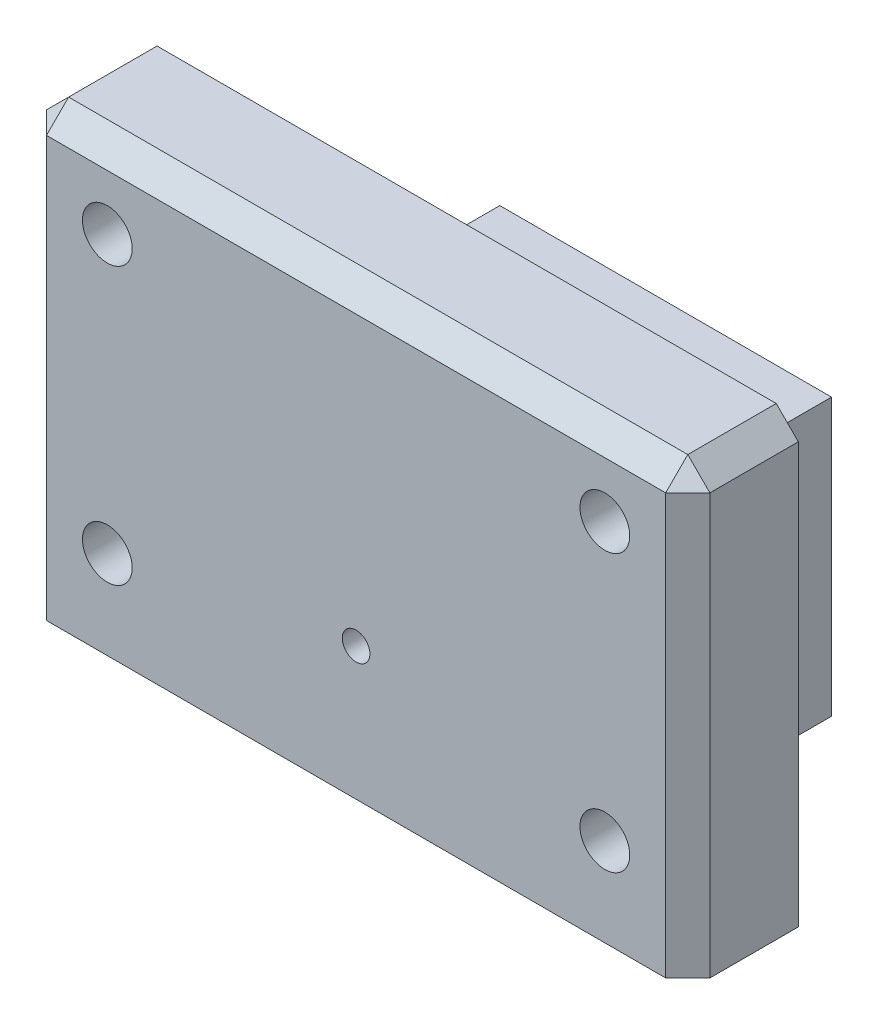
ISO-10303-21;
HEADER;
FILE_DESCRIPTION(('STEP AP214'),'2;1');
FILE_NAME('part.step','',(''),(''),'','','');
FILE_SCHEMA(('AUTOMOTIVE_DESIGN { 1 0 10303 214 1 1 1 1 }'));
ENDSEC;
DATA;
#1=APPLICATION_CONTEXT('core data for automotive mechanical design processes');
#2=APPLICATION_PROTOCOL_DEFINITION('international standard','automotive_design',2000,#1);
#3=PRODUCT_CONTEXT('',#1,'mechanical');
#4=PRODUCT('Part','Part','',(#3));
#5=PRODUCT_RELATED_PRODUCT_CATEGORY('part','',(#4));
#6=PRODUCT_DEFINITION_FORMATION('','',#4);
#7=PRODUCT_DEFINITION_CONTEXT('part definition',#1,'design');
#8=PRODUCT_DEFINITION('design','',#6,#7);
#9=PRODUCT_DEFINITION_SHAPE('','',#8);
#10=(LENGTH_UNIT() NAMED_UNIT(*) SI_UNIT(.MILLI.,.METRE.));
#11=(NAMED_UNIT(*) PLANE_ANGLE_UNIT() SI_UNIT($,.RADIAN.));
#12=(NAMED_UNIT(*) SI_UNIT($,.STERADIAN.) SOLID_ANGLE_UNIT());
#13=UNCERTAINTY_MEASURE_WITH_UNIT(LENGTH_MEASURE(1.E-05),#10,'distance_accuracy_value','');
#14=(GEOMETRIC_REPRESENTATION_CONTEXT(3) GLOBAL_UNCERTAINTY_ASSIGNED_CONTEXT((#13)) GLOBAL_UNIT_ASSIGNED_CONTEXT((#10,
#11,#12)) REPRESENTATION_CONTEXT('',''));
#15=CARTESIAN_POINT('',(0.,0.,0.));
#16=DIRECTION('',(0.,0.,1.));
#17=DIRECTION('',(1.,0.,0.));
#18=AXIS2_PLACEMENT_3D('',#15,#16,#17);
#19=CARTESIAN_POINT('',(0.,12.5,0.));
#20=DIRECTION('',(0.,-1.,0.));
#21=DIRECTION('',(0.,0.,-1.));
#22=AXIS2_PLACEMENT_3D('',#19,#20,#21);
#23=PLANE('',#22);
#24=CARTESIAN_POINT('',(0.,12.5,0.));
#25=DIRECTION('',(0.,1.,0.));
#26=DIRECTION('',(0.,0.,1.));
#27=AXIS2_PLACEMENT_3D('',#24,#25,#26);
#28=CIRCLE('',#27,4.);
#29=CARTESIAN_POINT('',(0.,12.5,4.));
#30=VERTEX_POINT('',#29);
#31=EDGE_CURVE('E215',#30,#30,#28,.T.);
#32=ORIENTED_EDGE('',*,*,#31,.F.);
#33=EDGE_LOOP('',(#32));
#34=FACE_BOUND('',#33,.T.);
#35=DIRECTION('',(-1.,0.,0.));
#36=VECTOR('',#35,1.);
#37=CARTESIAN_POINT('',(-30.,12.5,9.));
#38=LINE('',#37,#36);
#39=CARTESIAN_POINT('',(15.,12.5,9.));
#40=VERTEX_POINT('',#39);
#41=CARTESIAN_POINT('',(-15.,12.5,9.));
#42=VERTEX_POINT('',#41);
#43=EDGE_CURVE('E122',#40,#42,#38,.T.);
#44=ORIENTED_EDGE('',*,*,#43,.F.);
#45=DIRECTION('',(0.,0.,-1.));
#46=VECTOR('',#45,1.);
#47=CARTESIAN_POINT('',(15.,12.5,-9.));
#48=LINE('',#47,#46);
#49=CARTESIAN_POINT('',(15.,12.5,-9.));
#50=VERTEX_POINT('',#49);
#51=EDGE_CURVE('E129',#40,#50,#48,.T.);
#52=ORIENTED_EDGE('',*,*,#51,.T.);
#53=DIRECTION('',(-1.,0.,0.));
#54=VECTOR('',#53,1.);
#55=CARTESIAN_POINT('',(-15.,12.5,-9.));
#56=LINE('',#55,#54);
#57=CARTESIAN_POINT('',(-15.,12.5,-9.));
#58=VERTEX_POINT('',#57);
#59=EDGE_CURVE('E125',#50,#58,#56,.T.);
#60=ORIENTED_EDGE('',*,*,#59,.T.);
#61=DIRECTION('',(0.,0.,1.));
#62=VECTOR('',#61,1.);
#63=CARTESIAN_POINT('',(-15.,12.5,-9.));
#64=LINE('',#63,#62);
#65=EDGE_CURVE('E119',#58,#42,#64,.T.);
#66=ORIENTED_EDGE('',*,*,#65,.T.);
#67=EDGE_LOOP('',(#44,#52,#60,#66));
#68=FACE_BOUND('',#67,.T.);
#69=ADVANCED_FACE('F32',(#34,#68),#23,.F.);
#70=CARTESIAN_POINT('',(0.,-12.5,0.));
#71=DIRECTION('',(0.,-1.,0.));
#72=DIRECTION('',(0.,0.,-1.));
#73=AXIS2_PLACEMENT_3D('',#70,#71,#72);
#74=PLANE('',#73);
#75=DIRECTION('',(0.,0.,-1.));
#76=VECTOR('',#75,1.);
#77=CARTESIAN_POINT('',(30.,-12.5,9.));
#78=LINE('',#77,#76);
#79=CARTESIAN_POINT('',(30.,-12.5,17.));
#80=VERTEX_POINT('',#79);
#81=CARTESIAN_POINT('',(30.,-12.5,9.));
#82=VERTEX_POINT('',#81);
#83=EDGE_CURVE('E233',#80,#82,#78,.T.);
#84=ORIENTED_EDGE('',*,*,#83,.F.);
#85=DIRECTION('',(0.707106781186546,0.,-0.707106781186549));
#86=VECTOR('',#85,1.);
#87=CARTESIAN_POINT('',(23.5,-12.5,23.5));
#88=LINE('',#87,#86);
#89=CARTESIAN_POINT('',(28.,-12.5,19.));
#90=VERTEX_POINT('',#89);
#91=EDGE_CURVE('E185',#80,#90,#88,.F.);
#92=ORIENTED_EDGE('',*,*,#91,.T.);
#93=DIRECTION('',(1.,0.,0.));
#94=VECTOR('',#93,1.);
#95=CARTESIAN_POINT('',(30.,-12.5,19.));
#96=LINE('',#95,#94);
#97=CARTESIAN_POINT('',(-28.,-12.5,19.));
#98=VERTEX_POINT('',#97);
#99=EDGE_CURVE('E231',#98,#90,#96,.T.);
#100=ORIENTED_EDGE('',*,*,#99,.F.);
#101=DIRECTION('',(0.707106781186548,0.,0.707106781186548));
#102=VECTOR('',#101,1.);
#103=CARTESIAN_POINT('',(-23.5,-12.5,23.5));
#104=LINE('',#103,#102);
#105=CARTESIAN_POINT('',(-30.,-12.5,17.));
#106=VERTEX_POINT('',#105);
#107=EDGE_CURVE('E183',#98,#106,#104,.F.);
#108=ORIENTED_EDGE('',*,*,#107,.T.);
#109=DIRECTION('',(0.,0.,1.));
#110=VECTOR('',#109,1.);
#111=CARTESIAN_POINT('',(-30.,-12.5,9.));
#112=LINE('',#111,#110);
#113=CARTESIAN_POINT('',(-30.,-12.5,9.));
#114=VERTEX_POINT('',#113);
#115=EDGE_CURVE('E228',#114,#106,#112,.T.);
#116=ORIENTED_EDGE('',*,*,#115,.F.);
#117=DIRECTION('',(-1.,0.,0.));
#118=VECTOR('',#117,1.);
#119=CARTESIAN_POINT('',(-15.,-12.5,9.));
#120=LINE('',#119,#118);
#121=CARTESIAN_POINT('',(-15.,-12.5,9.));
#122=VERTEX_POINT('',#121);
#123=EDGE_CURVE('E226',#122,#114,#120,.T.);
#124=ORIENTED_EDGE('',*,*,#123,.F.);
#125=DIRECTION('',(0.,0.,1.));
#126=VECTOR('',#125,1.);
#127=CARTESIAN_POINT('',(-15.,-12.5,-9.));
#128=LINE('',#127,#126);
#129=CARTESIAN_POINT('',(-15.,-12.5,-9.));
#130=VERTEX_POINT('',#129);
#131=EDGE_CURVE('E137',#130,#122,#128,.T.);
#132=ORIENTED_EDGE('',*,*,#131,.F.);
#133=DIRECTION('',(-1.,0.,0.));
#134=VECTOR('',#133,1.);
#135=CARTESIAN_POINT('',(-15.,-12.5,-9.));
#136=LINE('',#135,#134);
#137=CARTESIAN_POINT('',(15.,-12.5,-9.));
#138=VERTEX_POINT('',#137);
#139=EDGE_CURVE('E130',#138,#130,#136,.T.);
#140=ORIENTED_EDGE('',*,*,#139,.F.);
#141=DIRECTION('',(0.,0.,-1.));
#142=VECTOR('',#141,1.);
#143=CARTESIAN_POINT('',(15.,-12.5,-9.));
#144=LINE('',#143,#142);
#145=CARTESIAN_POINT('',(15.,-12.5,9.));
#146=VERTEX_POINT('',#145);
#147=EDGE_CURVE('E237',#146,#138,#144,.T.);
#148=ORIENTED_EDGE('',*,*,#147,.F.);
#149=DIRECTION('',(-1.,0.,0.));
#150=VECTOR('',#149,1.);
#151=CARTESIAN_POINT('',(30.,-12.5,9.));
#152=LINE('',#151,#150);
#153=EDGE_CURVE('E235',#82,#146,#152,.T.);
#154=ORIENTED_EDGE('',*,*,#153,.F.);
#155=EDGE_LOOP('',(#84,#92,#100,#108,#116,#124,#132,#140,#148,#154));
#156=FACE_BOUND('',#155,.T.);
#157=CARTESIAN_POINT('',(0.,-12.5,0.));
#158=DIRECTION('',(0.,1.,0.));
#159=DIRECTION('',(0.,0.,1.));
#160=AXIS2_PLACEMENT_3D('',#157,#158,#159);
#161=CIRCLE('',#160,4.);
#162=CARTESIAN_POINT('',(0.,-12.5,4.));
#163=VERTEX_POINT('',#162);
#164=EDGE_CURVE('E209',#163,#163,#161,.T.);
#165=ORIENTED_EDGE('',*,*,#164,.T.);
#166=EDGE_LOOP('',(#165));
#167=FACE_BOUND('',#166,.T.);
#168=ADVANCED_FACE('F252',(#156,#167),#74,.T.);
#169=CARTESIAN_POINT('',(-15.,12.5,-9.));
#170=DIRECTION('',(1.,0.,0.));
#171=DIRECTION('',(0.,0.,-1.));
#172=AXIS2_PLACEMENT_3D('',#169,#170,#171);
#173=PLANE('',#172);
#174=ORIENTED_EDGE('',*,*,#131,.T.);
#175=DIRECTION('',(0.,-1.,0.));
#176=VECTOR('',#175,1.);
#177=CARTESIAN_POINT('',(-15.,12.5,9.));
#178=LINE('',#177,#176);
#179=EDGE_CURVE('E134',#42,#122,#178,.T.);
#180=ORIENTED_EDGE('',*,*,#179,.F.);
#181=ORIENTED_EDGE('',*,*,#65,.F.);
#182=DIRECTION('',(0.,-1.,0.));
#183=VECTOR('',#182,1.);
#184=CARTESIAN_POINT('',(-15.,12.5,-9.));
#185=LINE('',#184,#183);
#186=EDGE_CURVE('E224',#58,#130,#185,.T.);
#187=ORIENTED_EDGE('',*,*,#186,.T.);
#188=EDGE_LOOP('',(#174,#180,#181,#187));
#189=FACE_BOUND('',#188,.T.);
#190=ADVANCED_FACE('F135',(#189),#173,.F.);
#191=CARTESIAN_POINT('',(-30.,12.5,9.));
#192=DIRECTION('',(1.,0.,0.));
#193=DIRECTION('',(0.,0.,-1.));
#194=AXIS2_PLACEMENT_3D('',#191,#192,#193);
#195=PLANE('',#194);
#196=DIRECTION('',(0.,1.,0.));
#197=VECTOR('',#196,1.);
#198=CARTESIAN_POINT('',(-30.,12.5,17.));
#199=LINE('',#198,#197);
#200=CARTESIAN_POINT('',(-30.,25.5,17.));
#201=VERTEX_POINT('',#200);
#202=EDGE_CURVE('E171',#106,#201,#199,.T.);
#203=ORIENTED_EDGE('',*,*,#202,.T.);
#204=DIRECTION('',(0.,0.,-1.));
#205=VECTOR('',#204,1.);
#206=CARTESIAN_POINT('',(-30.,25.5,9.));
#207=LINE('',#206,#205);
#208=CARTESIAN_POINT('',(-30.,25.5,9.));
#209=VERTEX_POINT('',#208);
#210=EDGE_CURVE('E173',#201,#209,#207,.T.);
#211=ORIENTED_EDGE('',*,*,#210,.T.);
#212=DIRECTION('',(0.,-1.,0.));
#213=VECTOR('',#212,1.);
#214=CARTESIAN_POINT('',(-30.,12.5,9.));
#215=LINE('',#214,#213);
#216=EDGE_CURVE('E140',#209,#114,#215,.T.);
#217=ORIENTED_EDGE('',*,*,#216,.T.);
#218=ORIENTED_EDGE('',*,*,#115,.T.);
#219=EDGE_LOOP('',(#203,#211,#217,#218));
#220=FACE_BOUND('',#219,.T.);
#221=ADVANCED_FACE('F245',(#220),#195,.F.);
#222=CARTESIAN_POINT('',(30.,12.5,19.));
#223=DIRECTION('',(0.,0.,-1.));
#224=DIRECTION('',(-1.,0.,0.));
#225=AXIS2_PLACEMENT_3D('',#222,#223,#224);
#226=PLANE('',#225);
#227=CARTESIAN_POINT('',(0.,-0.499999999999999,19.));
#228=DIRECTION('',(0.,0.,1.));
#229=DIRECTION('',(1.,0.,0.));
#230=AXIS2_PLACEMENT_3D('',#227,#228,#229);
#231=CIRCLE('',#230,1.25);
#232=CARTESIAN_POINT('',(1.25,-0.499999999999999,19.));
#233=VERTEX_POINT('',#232);
#234=EDGE_CURVE('E515',#233,#233,#231,.T.);
#235=ORIENTED_EDGE('',*,*,#234,.F.);
#236=EDGE_LOOP('',(#235));
#237=FACE_BOUND('',#236,.T.);
#238=CARTESIAN_POINT('',(-22.5,-4.49999999999999,19.));
#239=DIRECTION('',(0.,0.,-1.));
#240=DIRECTION('',(-1.,0.,0.));
#241=AXIS2_PLACEMENT_3D('',#238,#239,#240);
#242=CIRCLE('',#241,2.25);
#243=CARTESIAN_POINT('',(-24.75,-4.49999999999999,19.));
#244=VERTEX_POINT('',#243);
#245=EDGE_CURVE('E516',#244,#244,#242,.T.);
#246=ORIENTED_EDGE('',*,*,#245,.T.);
#247=EDGE_LOOP('',(#246));
#248=FACE_BOUND('',#247,.T.);
#249=CARTESIAN_POINT('',(-22.5,20.5,19.));
#250=DIRECTION('',(0.,0.,-1.));
#251=DIRECTION('',(-1.,0.,0.));
#252=AXIS2_PLACEMENT_3D('',#249,#250,#251);
#253=CIRCLE('',#252,2.25);
#254=CARTESIAN_POINT('',(-24.75,20.5,19.));
#255=VERTEX_POINT('',#254);
#256=EDGE_CURVE('E523',#255,#255,#253,.T.);
#257=ORIENTED_EDGE('',*,*,#256,.T.);
#258=EDGE_LOOP('',(#257));
#259=FACE_BOUND('',#258,.T.);
#260=CARTESIAN_POINT('',(22.5,-4.5,19.));
#261=DIRECTION('',(0.,0.,-1.));
#262=DIRECTION('',(-1.,0.,0.));
#263=AXIS2_PLACEMENT_3D('',#260,#261,#262);
#264=CIRCLE('',#263,2.25);
#265=CARTESIAN_POINT('',(20.25,-4.5,19.));
#266=VERTEX_POINT('',#265);
#267=EDGE_CURVE('E529',#266,#266,#264,.T.);
#268=ORIENTED_EDGE('',*,*,#267,.T.);
#269=EDGE_LOOP('',(#268));
#270=FACE_BOUND('',#269,.T.);
#271=CARTESIAN_POINT('',(22.5,20.5,19.));
#272=DIRECTION('',(0.,0.,-1.));
#273=DIRECTION('',(-1.,0.,0.));
#274=AXIS2_PLACEMENT_3D('',#271,#272,#273);
#275=CIRCLE('',#274,2.25);
#276=CARTESIAN_POINT('',(20.25,20.5,19.));
#277=VERTEX_POINT('',#276);
#278=EDGE_CURVE('E193',#277,#277,#275,.T.);
#279=ORIENTED_EDGE('',*,*,#278,.T.);
#280=EDGE_LOOP('',(#279));
#281=FACE_BOUND('',#280,.T.);
#282=ORIENTED_EDGE('',*,*,#99,.T.);
#283=DIRECTION('',(0.,1.,0.));
#284=VECTOR('',#283,1.);
#285=CARTESIAN_POINT('',(28.,12.5,19.));
#286=LINE('',#285,#284);
#287=CARTESIAN_POINT('',(28.,25.5,19.));
#288=VERTEX_POINT('',#287);
#289=EDGE_CURVE('E11',#90,#288,#286,.T.);
#290=ORIENTED_EDGE('',*,*,#289,.T.);
#291=DIRECTION('',(-1.,0.,0.));
#292=VECTOR('',#291,1.);
#293=CARTESIAN_POINT('',(-30.,25.5,19.));
#294=LINE('',#293,#292);
#295=CARTESIAN_POINT('',(-28.,25.5,19.));
#296=VERTEX_POINT('',#295);
#297=EDGE_CURVE('E41',#288,#296,#294,.T.);
#298=ORIENTED_EDGE('',*,*,#297,.T.);
#299=DIRECTION('',(0.,-1.,0.));
#300=VECTOR('',#299,1.);
#301=CARTESIAN_POINT('',(-28.,12.5,19.));
#302=LINE('',#301,#300);
#303=EDGE_CURVE('E187',#296,#98,#302,.T.);
#304=ORIENTED_EDGE('',*,*,#303,.T.);
#305=EDGE_LOOP('',(#282,#290,#298,#304));
#306=FACE_BOUND('',#305,.T.);
#307=ADVANCED_FACE('F305',(#237,#248,#259,#270,#281,#306),#226,.F.);
#308=CARTESIAN_POINT('',(30.,12.5,9.));
#309=DIRECTION('',(-1.,0.,0.));
#310=DIRECTION('',(0.,0.,1.));
#311=AXIS2_PLACEMENT_3D('',#308,#309,#310);
#312=PLANE('',#311);
#313=DIRECTION('',(0.,-1.,0.));
#314=VECTOR('',#313,1.);
#315=CARTESIAN_POINT('',(30.,12.5,9.));
#316=LINE('',#315,#314);
#317=CARTESIAN_POINT('',(30.,25.5,9.));
#318=VERTEX_POINT('',#317);
#319=EDGE_CURVE('E160',#318,#82,#316,.T.);
#320=ORIENTED_EDGE('',*,*,#319,.F.);
#321=DIRECTION('',(0.,0.,1.));
#322=VECTOR('',#321,1.);
#323=CARTESIAN_POINT('',(30.,25.5,19.));
#324=LINE('',#323,#322);
#325=CARTESIAN_POINT('',(30.,25.5,17.));
#326=VERTEX_POINT('',#325);
#327=EDGE_CURVE('E181',#318,#326,#324,.T.);
#328=ORIENTED_EDGE('',*,*,#327,.T.);
#329=DIRECTION('',(0.,-1.,0.));
#330=VECTOR('',#329,1.);
#331=CARTESIAN_POINT('',(30.,12.5,17.));
#332=LINE('',#331,#330);
#333=EDGE_CURVE('E179',#326,#80,#332,.T.);
#334=ORIENTED_EDGE('',*,*,#333,.T.);
#335=ORIENTED_EDGE('',*,*,#83,.T.);
#336=EDGE_LOOP('',(#320,#328,#334,#335));
#337=FACE_BOUND('',#336,.T.);
#338=ADVANCED_FACE('F301',(#337),#312,.F.);
#339=CARTESIAN_POINT('',(30.,12.5,9.));
#340=DIRECTION('',(0.,0.,1.));
#341=DIRECTION('',(1.,0.,0.));
#342=AXIS2_PLACEMENT_3D('',#339,#340,#341);
#343=PLANE('',#342);
#344=CARTESIAN_POINT('',(-22.5,-4.49999999999999,8.99999999999999));
#345=DIRECTION('',(0.,0.,-1.));
#346=DIRECTION('',(-1.,0.,0.));
#347=AXIS2_PLACEMENT_3D('',#344,#345,#346);
#348=CIRCLE('',#347,2.25);
#349=CARTESIAN_POINT('',(-24.75,-4.49999999999999,8.99999999999999));
#350=VERTEX_POINT('',#349);
#351=EDGE_CURVE('E520',#350,#350,#348,.T.);
#352=ORIENTED_EDGE('',*,*,#351,.F.);
#353=EDGE_LOOP('',(#352));
#354=FACE_BOUND('',#353,.T.);
#355=CARTESIAN_POINT('',(-22.5,20.5,8.99999999999999));
#356=DIRECTION('',(0.,0.,-1.));
#357=DIRECTION('',(-1.,0.,0.));
#358=AXIS2_PLACEMENT_3D('',#355,#356,#357);
#359=CIRCLE('',#358,2.25);
#360=CARTESIAN_POINT('',(-24.75,20.5,8.99999999999999));
#361=VERTEX_POINT('',#360);
#362=EDGE_CURVE('E519',#361,#361,#359,.T.);
#363=ORIENTED_EDGE('',*,*,#362,.F.);
#364=EDGE_LOOP('',(#363));
#365=FACE_BOUND('',#364,.T.);
#366=CARTESIAN_POINT('',(22.5,-4.5,9.));
#367=DIRECTION('',(0.,0.,-1.));
#368=DIRECTION('',(-1.,0.,0.));
#369=AXIS2_PLACEMENT_3D('',#366,#367,#368);
#370=CIRCLE('',#369,2.25);
#371=CARTESIAN_POINT('',(20.25,-4.5,9.));
#372=VERTEX_POINT('',#371);
#373=EDGE_CURVE('E526',#372,#372,#370,.T.);
#374=ORIENTED_EDGE('',*,*,#373,.F.);
#375=EDGE_LOOP('',(#374));
#376=FACE_BOUND('',#375,.T.);
#377=CARTESIAN_POINT('',(22.5,20.5,9.));
#378=DIRECTION('',(0.,0.,-1.));
#379=DIRECTION('',(-1.,0.,0.));
#380=AXIS2_PLACEMENT_3D('',#377,#378,#379);
#381=CIRCLE('',#380,2.25);
#382=CARTESIAN_POINT('',(20.25,20.5,9.));
#383=VERTEX_POINT('',#382);
#384=EDGE_CURVE('E219',#383,#383,#381,.T.);
#385=ORIENTED_EDGE('',*,*,#384,.F.);
#386=EDGE_LOOP('',(#385));
#387=FACE_BOUND('',#386,.T.);
#388=ORIENTED_EDGE('',*,*,#216,.F.);
#389=DIRECTION('',(0.707106781186547,0.707106781186548,0.));
#390=VECTOR('',#389,1.);
#391=CARTESIAN_POINT('',(-28.,27.5,8.99999999999999));
#392=LINE('',#391,#390);
#393=CARTESIAN_POINT('',(-28.,27.5,9.));
#394=VERTEX_POINT('',#393);
#395=EDGE_CURVE('E177',#209,#394,#392,.T.);
#396=ORIENTED_EDGE('',*,*,#395,.T.);
#397=DIRECTION('',(-1.,0.,0.));
#398=VECTOR('',#397,1.);
#399=CARTESIAN_POINT('',(-30.,27.5,9.));
#400=LINE('',#399,#398);
#401=CARTESIAN_POINT('',(28.,27.5,9.));
#402=VERTEX_POINT('',#401);
#403=EDGE_CURVE('E206',#402,#394,#400,.T.);
#404=ORIENTED_EDGE('',*,*,#403,.F.);
#405=DIRECTION('',(0.707106781186546,-0.707106781186549,0.));
#406=VECTOR('',#405,1.);
#407=CARTESIAN_POINT('',(28.,27.5,9.));
#408=LINE('',#407,#406);
#409=EDGE_CURVE('E175',#402,#318,#408,.T.);
#410=ORIENTED_EDGE('',*,*,#409,.T.);
#411=ORIENTED_EDGE('',*,*,#319,.T.);
#412=ORIENTED_EDGE('',*,*,#153,.T.);
#413=DIRECTION('',(0.,-1.,0.));
#414=VECTOR('',#413,1.);
#415=CARTESIAN_POINT('',(15.,12.5,9.));
#416=LINE('',#415,#414);
#417=EDGE_CURVE('E145',#40,#146,#416,.T.);
#418=ORIENTED_EDGE('',*,*,#417,.F.);
#419=ORIENTED_EDGE('',*,*,#43,.T.);
#420=ORIENTED_EDGE('',*,*,#179,.T.);
#421=ORIENTED_EDGE('',*,*,#123,.T.);
#422=EDGE_LOOP('',(#388,#396,#404,#410,#411,#412,#418,#419,#420,#421));
#423=FACE_BOUND('',#422,.T.);
#424=ADVANCED_FACE('F143',(#354,#365,#376,#387,#423),#343,.F.);
#425=CARTESIAN_POINT('',(15.,12.5,-9.));
#426=DIRECTION('',(-1.,0.,0.));
#427=DIRECTION('',(0.,0.,1.));
#428=AXIS2_PLACEMENT_3D('',#425,#426,#427);
#429=PLANE('',#428);
#430=ORIENTED_EDGE('',*,*,#147,.T.);
#431=DIRECTION('',(0.,-1.,0.));
#432=VECTOR('',#431,1.);
#433=CARTESIAN_POINT('',(15.,12.5,-9.));
#434=LINE('',#433,#432);
#435=EDGE_CURVE('E161',#50,#138,#434,.T.);
#436=ORIENTED_EDGE('',*,*,#435,.F.);
#437=ORIENTED_EDGE('',*,*,#51,.F.);
#438=ORIENTED_EDGE('',*,*,#417,.T.);
#439=EDGE_LOOP('',(#430,#436,#437,#438));
#440=FACE_BOUND('',#439,.T.);
#441=ADVANCED_FACE('F294',(#440),#429,.F.);
#442=CARTESIAN_POINT('',(-15.,12.5,-9.));
#443=DIRECTION('',(0.,0.,1.));
#444=DIRECTION('',(1.,0.,0.));
#445=AXIS2_PLACEMENT_3D('',#442,#443,#444);
#446=PLANE('',#445);
#447=ORIENTED_EDGE('',*,*,#139,.T.);
#448=ORIENTED_EDGE('',*,*,#186,.F.);
#449=ORIENTED_EDGE('',*,*,#59,.F.);
#450=ORIENTED_EDGE('',*,*,#435,.T.);
#451=EDGE_LOOP('',(#447,#448,#449,#450));
#452=FACE_BOUND('',#451,.T.);
#453=ADVANCED_FACE('F279',(#452),#446,.F.);
#454=CARTESIAN_POINT('',(0.,12.5,0.));
#455=DIRECTION('',(0.,-1.,0.));
#456=DIRECTION('',(0.,0.,-1.));
#457=AXIS2_PLACEMENT_3D('',#454,#455,#456);
#458=CYLINDRICAL_SURFACE('',#457,4.);
#459=CARTESIAN_POINT('',(1.25,-0.499999999999999,3.79967103839267));
#460=CARTESIAN_POINT('',(1.24999953780047,-0.431652963890662,3.79967145961936));
#461=CARTESIAN_POINT('',(1.24437538791495,-0.363301231296798,3.80153531505043));
#462=CARTESIAN_POINT('',(1.22209175401327,-0.228605839122192,3.80875638998877));
#463=CARTESIAN_POINT('',(1.20542928782515,-0.162262727267838,3.81411455353136));
#464=CARTESIAN_POINT('',(1.16169788223559,-0.0335550980679984,3.8276593883596));
#465=CARTESIAN_POINT('',(1.13464735736677,0.0288162331056807,3.83584105194317));
#466=CARTESIAN_POINT('',(1.07096914173157,0.148152695864015,3.85410406218688));
#467=CARTESIAN_POINT('',(1.03433975905632,0.205116869960125,3.86418574435841));
#468=CARTESIAN_POINT('',(0.951196070622294,0.313978867493488,3.8855012766862));
#469=CARTESIAN_POINT('',(0.9044093997204,0.365663609435987,3.8967612338478));
#470=CARTESIAN_POINT('',(0.802862046455497,0.460596013209188,3.91894245860336));
#471=CARTESIAN_POINT('',(0.748100252518567,0.503842496944848,3.92986367872627));
#472=CARTESIAN_POINT('',(0.630625912493365,0.581611063011247,3.95043553390078));
#473=CARTESIAN_POINT('',(0.567761556520097,0.615913703831458,3.9600518456278));
#474=CARTESIAN_POINT('',(0.436804232853406,0.673376049855551,3.97662551833019));
#475=CARTESIAN_POINT('',(0.368712498487054,0.696538374149587,3.98358350419919));
#476=CARTESIAN_POINT('',(0.2314643569661,0.730351128097071,3.99387175820863));
#477=CARTESIAN_POINT('',(0.162405715468217,0.741365749787851,3.99730738984143));
#478=CARTESIAN_POINT('',(0.0233408139845225,0.751724346437527,4.00053595876015));
#479=CARTESIAN_POINT('',(-0.0466652269730813,0.751070974358831,4.00032972410065));
#480=CARTESIAN_POINT('',(-0.183074480354733,0.738351708414056,3.99637116132537));
#481=CARTESIAN_POINT('',(-0.249518634314042,0.72668061648698,3.99274150972157));
#482=CARTESIAN_POINT('',(-0.379453063347768,0.692905009957002,3.98249482560855));
#483=CARTESIAN_POINT('',(-0.442943145481194,0.670799814913449,3.97587759827134));
#484=CARTESIAN_POINT('',(-0.566078103154779,0.616529810925117,3.96023459729533));
#485=CARTESIAN_POINT('',(-0.625666405622829,0.58424519143697,3.95118033616957));
#486=CARTESIAN_POINT('',(-0.738702511152027,0.510628900295441,3.93161722953562));
#487=CARTESIAN_POINT('',(-0.792148756208835,0.469294940862167,3.92110801644584));
#488=CARTESIAN_POINT('',(-0.893737698453879,0.376726365198709,3.89923670734646));
#489=CARTESIAN_POINT('',(-0.941566549094176,0.325150931158803,3.88785731989084));
#490=CARTESIAN_POINT('',(-1.02798974259537,0.21460489817554,3.86590615440413));
#491=CARTESIAN_POINT('',(-1.06658299775341,0.155633429424999,3.85533447159847));
#492=CARTESIAN_POINT('',(-1.13380465019765,0.0310825311401582,3.83610846648974));
#493=CARTESIAN_POINT('',(-1.16231680702682,-0.0345634090423891,3.82747690354324));
#494=CARTESIAN_POINT('',(-1.20778345948513,-0.170059491895349,3.81337545338913));
#495=CARTESIAN_POINT('',(-1.22474210765793,-0.239908114210481,3.80790443033294));
#496=CARTESIAN_POINT('',(-1.24601485185708,-0.378819952565835,3.80099563391872));
#497=CARTESIAN_POINT('',(-1.25080954353711,-0.447801996232106,3.79940466389696));
#498=CARTESIAN_POINT('',(-1.24896744498307,-0.585589741498162,3.80001077463985));
#499=CARTESIAN_POINT('',(-1.24233242111456,-0.654395468700465,3.8022072700839));
#500=CARTESIAN_POINT('',(-1.21824873513143,-0.787808296651646,3.80998957482874));
#501=CARTESIAN_POINT('',(-1.20111831160537,-0.852479274073992,3.81547554101732));
#502=CARTESIAN_POINT('',(-1.15690373661027,-0.978021791996042,3.82911287331661));
#503=CARTESIAN_POINT('',(-1.12981796171154,-1.03889271092119,3.83726467412388));
#504=CARTESIAN_POINT('',(-1.06557510655875,-1.15703910977175,3.85560539653156));
#505=CARTESIAN_POINT('',(-1.02815147488557,-1.21416141559277,3.86584603489733));
#506=CARTESIAN_POINT('',(-0.944606408679809,-1.32149034636192,3.88710348972829));
#507=CARTESIAN_POINT('',(-0.898482714690782,-1.37169516892534,3.89812050735703));
#508=CARTESIAN_POINT('',(-0.796572947753603,-1.46591036591281,3.92024187562679));
#509=CARTESIAN_POINT('',(-0.740465649788519,-1.50957778613986,3.9313309228568));
#510=CARTESIAN_POINT('',(-0.621451545651395,-1.58689104332125,3.95189059843678));
#511=CARTESIAN_POINT('',(-0.558545051108621,-1.62053733931104,3.96136130090946));
#512=CARTESIAN_POINT('',(-0.428105523331829,-1.67653056247168,3.97756311928512));
#513=CARTESIAN_POINT('',(-0.360610184283754,-1.69895928784368,3.984313995612));
#514=CARTESIAN_POINT('',(-0.222557254056387,-1.73207253858971,3.99440242648576));
#515=CARTESIAN_POINT('',(-0.152000628340354,-1.74276073908349,3.99774104914277));
#516=CARTESIAN_POINT('',(-0.0129849366488967,-1.75179100174962,4.00055803404462));
#517=CARTESIAN_POINT('',(0.0554391919465245,-1.75062845017076,4.0001912940739));
#518=CARTESIAN_POINT('',(0.19107322192325,-1.7371881889513,3.99600978081049));
#519=CARTESIAN_POINT('',(0.25828320217957,-1.72491120400805,3.99219523232619));
#520=CARTESIAN_POINT('',(0.388755118480793,-1.68990599077772,3.98159570844796));
#521=CARTESIAN_POINT('',(0.452055918449483,-1.66731039215463,3.97484847960205));
#522=CARTESIAN_POINT('',(0.573998425500093,-1.61242917279152,3.9590794558795));
#523=CARTESIAN_POINT('',(0.632639331274484,-1.58014189002657,3.95005727091358));
#524=CARTESIAN_POINT('',(0.745761694969691,-1.50552724165556,3.93029896883376));
#525=CARTESIAN_POINT('',(0.800034607053113,-1.46289647753603,3.91951509750962));
#526=CARTESIAN_POINT('',(0.900820791399321,-1.36934011055653,3.89758736547061));
#527=CARTESIAN_POINT('',(0.947331733504162,-1.31841202586061,3.88644339784826));
#528=CARTESIAN_POINT('',(1.03282865911253,-1.2076842801589,3.86461892577438));
#529=CARTESIAN_POINT('',(1.07151427994711,-1.14764659688342,3.85396600863456));
#530=CARTESIAN_POINT('',(1.13820470748522,-1.02160187973086,3.83480125279531));
#531=CARTESIAN_POINT('',(1.16621383403546,-0.955597273549748,3.82628854861386));
#532=CARTESIAN_POINT('',(1.20871180435793,-0.825277382685328,3.81306560440327));
#533=CARTESIAN_POINT('',(1.22414939837874,-0.761297452548434,3.80809315043749));
#534=CARTESIAN_POINT('',(1.244792458161,-0.631546167903509,3.80139606482398));
#535=CARTESIAN_POINT('',(1.25000044480779,-0.5657752587985,3.79967063301598));
#536=CARTESIAN_POINT('',(1.25,-0.499999999999999,3.79967103839267));
#537=B_SPLINE_CURVE_WITH_KNOTS('',3,(#459,#460,#461,#462,#463,#464,#465,#466,#467,#468,#469,
#470,#471,#472,#473,#474,#475,#476,#477,#478,#479,#480,#481,#482,#483,#484,#485,#486,#487,#488,
#489,#490,#491,#492,#493,#494,#495,#496,#497,#498,#499,#500,#501,#502,#503,#504,#505,#506,#507,
#508,#509,#510,#511,#512,#513,#514,#515,#516,#517,#518,#519,#520,#521,#522,#523,#524,#525,#526,
#527,#528,#529,#530,#531,#532,#533,#534,#535,#536),.UNSPECIFIED.,.T.,.F.,(4,2,2,2,2,2,2,2,2,2,2,
2,2,2,2,2,2,2,2,2,2,2,2,2,2,2,2,2,2,2,2,2,2,2,2,2,2,2,4),(0.,0.20479813754849,0.409651627059736,
0.614143644118582,0.818671804924949,1.02957080550838,1.24049922941123,1.45619821963733,
1.67184647417922,1.88083722835534,2.08978046471775,2.29150982969751,2.49325235190093,
2.69746404608409,2.90172742713188,3.11450338937334,3.32730439853776,3.54248470934454,
3.75758763952753,3.96404933287936,4.1704791221909,4.37093972044363,4.5714330225321,
4.77767613309611,4.98397288011881,5.19881937811512,5.41365603317087,5.62690239290998,
5.84008198140585,6.04438802439525,6.24868074692307,6.4504184651476,6.65219079911652,
6.86080693105216,7.06948557772191,7.28507795501705,7.50058300803823,7.69772354371387,
7.8948154918878),.UNSPECIFIED.);
#538=CARTESIAN_POINT('',(1.25,-0.499999999999999,3.79967103839267));
#539=VERTEX_POINT('',#538);
#540=EDGE_CURVE('E509',#539,#539,#537,.T.);
#541=ORIENTED_EDGE('',*,*,#540,.T.);
#542=EDGE_LOOP('',(#541));
#543=FACE_BOUND('',#542,.T.);
#544=ORIENTED_EDGE('',*,*,#31,.T.);
#545=EDGE_LOOP('',(#544));
#546=FACE_BOUND('',#545,.T.);
#547=ORIENTED_EDGE('',*,*,#164,.F.);
#548=EDGE_LOOP('',(#547));
#549=FACE_BOUND('',#548,.T.);
#550=ADVANCED_FACE('F271',(#543,#546,#549),#458,.F.);
#551=CARTESIAN_POINT('',(0.,27.5,0.));
#552=DIRECTION('',(0.,1.,0.));
#553=DIRECTION('',(0.,0.,1.));
#554=AXIS2_PLACEMENT_3D('',#551,#552,#553);
#555=PLANE('',#554);
#556=ORIENTED_EDGE('',*,*,#403,.T.);
#557=DIRECTION('',(0.,0.,1.));
#558=VECTOR('',#557,1.);
#559=CARTESIAN_POINT('',(-28.,27.5,19.));
#560=LINE('',#559,#558);
#561=CARTESIAN_POINT('',(-28.,27.5,17.));
#562=VERTEX_POINT('',#561);
#563=EDGE_CURVE('E168',#394,#562,#560,.T.);
#564=ORIENTED_EDGE('',*,*,#563,.T.);
#565=DIRECTION('',(1.,0.,0.));
#566=VECTOR('',#565,1.);
#567=CARTESIAN_POINT('',(30.,27.5,17.));
#568=LINE('',#567,#566);
#569=CARTESIAN_POINT('',(28.,27.5,17.));
#570=VERTEX_POINT('',#569);
#571=EDGE_CURVE('E147',#562,#570,#568,.T.);
#572=ORIENTED_EDGE('',*,*,#571,.T.);
#573=DIRECTION('',(0.,0.,-1.));
#574=VECTOR('',#573,1.);
#575=CARTESIAN_POINT('',(28.,27.5,9.));
#576=LINE('',#575,#574);
#577=EDGE_CURVE('E149',#570,#402,#576,.T.);
#578=ORIENTED_EDGE('',*,*,#577,.T.);
#579=EDGE_LOOP('',(#556,#564,#572,#578));
#580=FACE_BOUND('',#579,.T.);
#581=ADVANCED_FACE('F269',(#580),#555,.T.);
#582=CARTESIAN_POINT('',(28.,27.5,0.));
#583=DIRECTION('',(0.707106781186549,0.707106781186546,0.));
#584=DIRECTION('',(0.,0.,1.));
#585=AXIS2_PLACEMENT_3D('',#582,#583,#584);
#586=PLANE('',#585);
#587=ORIENTED_EDGE('',*,*,#409,.F.);
#588=ORIENTED_EDGE('',*,*,#577,.F.);
#589=DIRECTION('',(-0.707106781186546,0.707106781186549,0.));
#590=VECTOR('',#589,1.);
#591=CARTESIAN_POINT('',(30.,25.5,17.));
#592=LINE('',#591,#590);
#593=EDGE_CURVE('E36',#326,#570,#592,.T.);
#594=ORIENTED_EDGE('',*,*,#593,.F.);
#595=ORIENTED_EDGE('',*,*,#327,.F.);
#596=EDGE_LOOP('',(#587,#588,#594,#595));
#597=FACE_BOUND('',#596,.T.);
#598=ADVANCED_FACE('F34',(#597),#586,.T.);
#599=CARTESIAN_POINT('',(30.,12.5,17.));
#600=DIRECTION('',(-0.707106781186549,0.,-0.707106781186546));
#601=DIRECTION('',(0.,-1.,0.));
#602=AXIS2_PLACEMENT_3D('',#599,#600,#601);
#603=PLANE('',#602);
#604=ORIENTED_EDGE('',*,*,#91,.F.);
#605=ORIENTED_EDGE('',*,*,#333,.F.);
#606=DIRECTION('',(-0.707106781186546,0.,0.707106781186549));
#607=VECTOR('',#606,1.);
#608=CARTESIAN_POINT('',(30.,25.5,17.));
#609=LINE('',#608,#607);
#610=EDGE_CURVE('E201',#288,#326,#609,.F.);
#611=ORIENTED_EDGE('',*,*,#610,.F.);
#612=ORIENTED_EDGE('',*,*,#289,.F.);
#613=EDGE_LOOP('',(#604,#605,#611,#612));
#614=FACE_BOUND('',#613,.T.);
#615=ADVANCED_FACE('F277',(#614),#603,.F.);
#616=CARTESIAN_POINT('',(30.,25.5,17.));
#617=DIRECTION('',(0.577350269189628,0.577350269189625,0.577350269189624));
#618=DIRECTION('',(-0.707106781186546,0.707106781186549,0.));
#619=AXIS2_PLACEMENT_3D('',#616,#617,#618);
#620=PLANE('',#619);
#621=ORIENTED_EDGE('',*,*,#610,.T.);
#622=ORIENTED_EDGE('',*,*,#593,.T.);
#623=DIRECTION('',(0.,-0.707106781186546,0.707106781186549));
#624=VECTOR('',#623,1.);
#625=CARTESIAN_POINT('',(28.,26.5,18.));
#626=LINE('',#625,#624);
#627=EDGE_CURVE('E199',#288,#570,#626,.F.);
#628=ORIENTED_EDGE('',*,*,#627,.F.);
#629=EDGE_LOOP('',(#621,#622,#628));
#630=FACE_BOUND('',#629,.T.);
#631=ADVANCED_FACE('F323',(#630),#620,.T.);
#632=CARTESIAN_POINT('',(0.,27.5,17.));
#633=DIRECTION('',(0.,0.707106781186549,0.707106781186546));
#634=DIRECTION('',(-1.,0.,0.));
#635=AXIS2_PLACEMENT_3D('',#632,#633,#634);
#636=PLANE('',#635);
#637=ORIENTED_EDGE('',*,*,#627,.T.);
#638=ORIENTED_EDGE('',*,*,#571,.F.);
#639=DIRECTION('',(0.,0.707106781186546,-0.707106781186549));
#640=VECTOR('',#639,1.);
#641=CARTESIAN_POINT('',(-28.,27.5,17.));
#642=LINE('',#641,#640);
#643=EDGE_CURVE('E196',#296,#562,#642,.T.);
#644=ORIENTED_EDGE('',*,*,#643,.F.);
#645=ORIENTED_EDGE('',*,*,#297,.F.);
#646=EDGE_LOOP('',(#637,#638,#644,#645));
#647=FACE_BOUND('',#646,.T.);
#648=ADVANCED_FACE('F267',(#647),#636,.T.);
#649=CARTESIAN_POINT('',(-28.,12.5,19.));
#650=DIRECTION('',(0.707106781186547,0.,-0.707106781186547));
#651=DIRECTION('',(0.,-1.,0.));
#652=AXIS2_PLACEMENT_3D('',#649,#650,#651);
#653=PLANE('',#652);
#654=ORIENTED_EDGE('',*,*,#107,.F.);
#655=ORIENTED_EDGE('',*,*,#303,.F.);
#656=DIRECTION('',(-0.707106781186547,0.,-0.707106781186547));
#657=VECTOR('',#656,1.);
#658=CARTESIAN_POINT('',(-29.,25.5,18.));
#659=LINE('',#658,#657);
#660=EDGE_CURVE('E192',#201,#296,#659,.F.);
#661=ORIENTED_EDGE('',*,*,#660,.F.);
#662=ORIENTED_EDGE('',*,*,#202,.F.);
#663=EDGE_LOOP('',(#654,#655,#661,#662));
#664=FACE_BOUND('',#663,.T.);
#665=ADVANCED_FACE('F257',(#664),#653,.F.);
#666=CARTESIAN_POINT('',(-28.,27.5,17.));
#667=DIRECTION('',(-0.577350269189627,0.577350269189626,0.577350269189625));
#668=DIRECTION('',(-0.707106781186547,-0.707106781186548,0.));
#669=AXIS2_PLACEMENT_3D('',#666,#667,#668);
#670=PLANE('',#669);
#671=ORIENTED_EDGE('',*,*,#660,.T.);
#672=ORIENTED_EDGE('',*,*,#643,.T.);
#673=DIRECTION('',(-0.707106781186547,-0.707106781186548,0.));
#674=VECTOR('',#673,1.);
#675=CARTESIAN_POINT('',(-28.,27.5,17.));
#676=LINE('',#675,#674);
#677=EDGE_CURVE('E190',#201,#562,#676,.F.);
#678=ORIENTED_EDGE('',*,*,#677,.F.);
#679=EDGE_LOOP('',(#671,#672,#678));
#680=FACE_BOUND('',#679,.T.);
#681=ADVANCED_FACE('F264',(#680),#670,.T.);
#682=CARTESIAN_POINT('',(-28.,27.5,0.));
#683=DIRECTION('',(-0.707106781186548,0.707106781186547,0.));
#684=DIRECTION('',(0.,0.,-1.));
#685=AXIS2_PLACEMENT_3D('',#682,#683,#684);
#686=PLANE('',#685);
#687=ORIENTED_EDGE('',*,*,#395,.F.);
#688=ORIENTED_EDGE('',*,*,#210,.F.);
#689=ORIENTED_EDGE('',*,*,#677,.T.);
#690=ORIENTED_EDGE('',*,*,#563,.F.);
#691=EDGE_LOOP('',(#687,#688,#689,#690));
#692=FACE_BOUND('',#691,.T.);
#693=ADVANCED_FACE('F263',(#692),#686,.T.);
#694=CARTESIAN_POINT('',(22.5,20.5,19.));
#695=DIRECTION('',(0.,0.,-1.));
#696=DIRECTION('',(-1.,0.,0.));
#697=AXIS2_PLACEMENT_3D('',#694,#695,#696);
#698=CYLINDRICAL_SURFACE('',#697,2.25);
#699=ORIENTED_EDGE('',*,*,#278,.F.);
#700=EDGE_LOOP('',(#699));
#701=FACE_BOUND('',#700,.T.);
#702=ORIENTED_EDGE('',*,*,#384,.T.);
#703=EDGE_LOOP('',(#702));
#704=FACE_BOUND('',#703,.T.);
#705=ADVANCED_FACE('F316',(#701,#704),#698,.F.);
#706=CARTESIAN_POINT('',(22.5,-4.5,19.));
#707=DIRECTION('',(0.,0.,-1.));
#708=DIRECTION('',(-1.,0.,0.));
#709=AXIS2_PLACEMENT_3D('',#706,#707,#708);
#710=CYLINDRICAL_SURFACE('',#709,2.25);
#711=ORIENTED_EDGE('',*,*,#267,.F.);
#712=EDGE_LOOP('',(#711));
#713=FACE_BOUND('',#712,.T.);
#714=ORIENTED_EDGE('',*,*,#373,.T.);
#715=EDGE_LOOP('',(#714));
#716=FACE_BOUND('',#715,.T.);
#717=ADVANCED_FACE('F367',(#713,#716),#710,.F.);
#718=CARTESIAN_POINT('',(-22.5,20.5,19.));
#719=DIRECTION('',(0.,0.,-1.));
#720=DIRECTION('',(-1.,0.,0.));
#721=AXIS2_PLACEMENT_3D('',#718,#719,#720);
#722=CYLINDRICAL_SURFACE('',#721,2.25);
#723=ORIENTED_EDGE('',*,*,#256,.F.);
#724=EDGE_LOOP('',(#723));
#725=FACE_BOUND('',#724,.T.);
#726=ORIENTED_EDGE('',*,*,#362,.T.);
#727=EDGE_LOOP('',(#726));
#728=FACE_BOUND('',#727,.T.);
#729=ADVANCED_FACE('F374',(#725,#728),#722,.F.);
#730=CARTESIAN_POINT('',(-22.5,-4.49999999999999,19.));
#731=DIRECTION('',(0.,0.,-1.));
#732=DIRECTION('',(-1.,0.,0.));
#733=AXIS2_PLACEMENT_3D('',#730,#731,#732);
#734=CYLINDRICAL_SURFACE('',#733,2.25);
#735=ORIENTED_EDGE('',*,*,#245,.F.);
#736=EDGE_LOOP('',(#735));
#737=FACE_BOUND('',#736,.T.);
#738=ORIENTED_EDGE('',*,*,#351,.T.);
#739=EDGE_LOOP('',(#738));
#740=FACE_BOUND('',#739,.T.);
#741=ADVANCED_FACE('F382',(#737,#740),#734,.F.);
#742=CARTESIAN_POINT('',(0.,-0.499999999999999,-9.001025));
#743=DIRECTION('',(0.,0.,1.));
#744=DIRECTION('',(1.,0.,0.));
#745=AXIS2_PLACEMENT_3D('',#742,#743,#744);
#746=CYLINDRICAL_SURFACE('',#745,1.25);
#747=ORIENTED_EDGE('',*,*,#540,.F.);
#748=EDGE_LOOP('',(#747));
#749=FACE_BOUND('',#748,.T.);
#750=ORIENTED_EDGE('',*,*,#234,.T.);
#751=EDGE_LOOP('',(#750));
#752=FACE_BOUND('',#751,.T.);
#753=ADVANCED_FACE('F390',(#749,#752),#746,.F.);
#754=CLOSED_SHELL('',(#69,#168,#190,#221,#307,#338,#424,#441,#453,#550,#581,#598,#615,#631,#648,
#665,#681,#693,#705,#717,#729,#741,#753));
#755=MANIFOLD_SOLID_BREP('B2',#754);
#756=ADVANCED_BREP_SHAPE_REPRESENTATION('',(#18,#755),#14);
#757=SHAPE_DEFINITION_REPRESENTATION(#9,#756);
ENDSEC;
END-ISO-10303-21;
